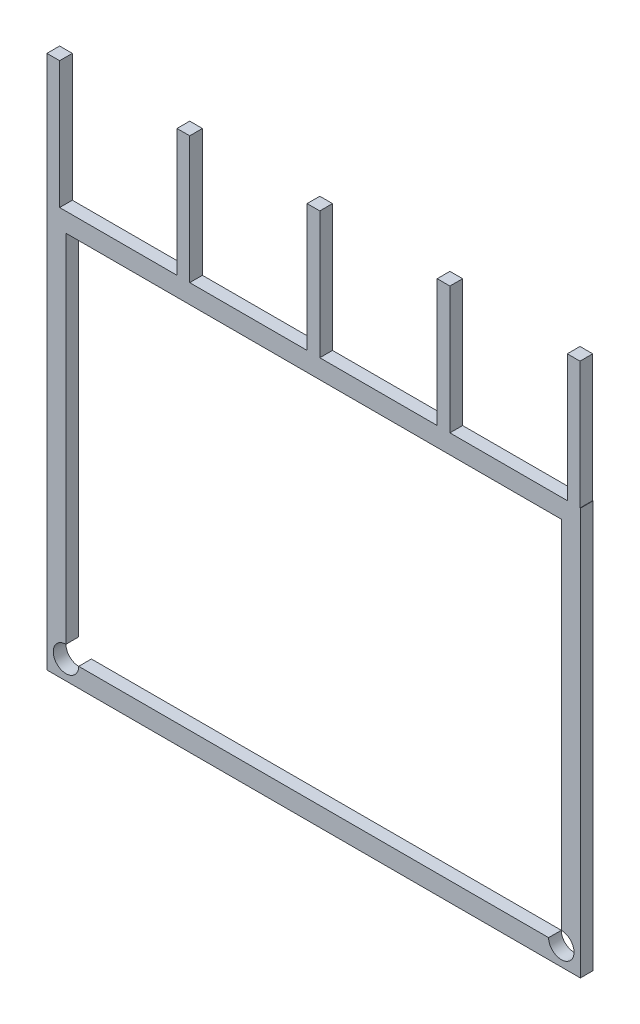
ISO-10303-21;
HEADER;
FILE_DESCRIPTION(('STEP AP214'),'2;1');
FILE_NAME('part.step','',(''),(''),'','','');
FILE_SCHEMA(('AUTOMOTIVE_DESIGN { 1 0 10303 214 1 1 1 1 }'));
ENDSEC;
DATA;
#1=APPLICATION_CONTEXT('core data for automotive mechanical design processes');
#2=APPLICATION_PROTOCOL_DEFINITION('international standard','automotive_design',2000,#1);
#3=PRODUCT_CONTEXT('',#1,'mechanical');
#4=PRODUCT('Part','Part','',(#3));
#5=PRODUCT_RELATED_PRODUCT_CATEGORY('part','',(#4));
#6=PRODUCT_DEFINITION_FORMATION('','',#4);
#7=PRODUCT_DEFINITION_CONTEXT('part definition',#1,'design');
#8=PRODUCT_DEFINITION('design','',#6,#7);
#9=PRODUCT_DEFINITION_SHAPE('','',#8);
#10=(LENGTH_UNIT() NAMED_UNIT(*) SI_UNIT(.MILLI.,.METRE.));
#11=(NAMED_UNIT(*) PLANE_ANGLE_UNIT() SI_UNIT($,.RADIAN.));
#12=(NAMED_UNIT(*) SI_UNIT($,.STERADIAN.) SOLID_ANGLE_UNIT());
#13=UNCERTAINTY_MEASURE_WITH_UNIT(LENGTH_MEASURE(1.E-05),#10,'distance_accuracy_value','');
#14=(GEOMETRIC_REPRESENTATION_CONTEXT(3) GLOBAL_UNCERTAINTY_ASSIGNED_CONTEXT((#13)) GLOBAL_UNIT_ASSIGNED_CONTEXT((#10,
#11,#12)) REPRESENTATION_CONTEXT('',''));
#15=CARTESIAN_POINT('',(0.,0.,0.));
#16=DIRECTION('',(0.,0.,1.));
#17=DIRECTION('',(1.,0.,0.));
#18=AXIS2_PLACEMENT_3D('',#15,#16,#17);
#19=CARTESIAN_POINT('',(0.,15.9965,0.5));
#20=DIRECTION('',(0.,-1.,0.));
#21=DIRECTION('',(0.,0.,-1.));
#22=AXIS2_PLACEMENT_3D('',#19,#20,#21);
#23=PLANE('',#22);
#24=DIRECTION('',(0.,0.,1.));
#25=VECTOR('',#24,1.);
#26=CARTESIAN_POINT('',(19.945,15.9965,-0.5));
#27=LINE('',#26,#25);
#28=CARTESIAN_POINT('',(19.945,15.9965,-0.5));
#29=VERTEX_POINT('',#28);
#30=CARTESIAN_POINT('',(19.945,15.9965,0.5));
#31=VERTEX_POINT('',#30);
#32=EDGE_CURVE('E244',#29,#31,#27,.T.);
#33=ORIENTED_EDGE('',*,*,#32,.F.);
#34=DIRECTION('',(-1.,0.,0.));
#35=VECTOR('',#34,1.);
#36=CARTESIAN_POINT('',(0.,15.9965,-0.5));
#37=LINE('',#36,#35);
#38=CARTESIAN_POINT('',(10.715,15.9965,-0.5));
#39=VERTEX_POINT('',#38);
#40=EDGE_CURVE('E406',#29,#39,#37,.T.);
#41=ORIENTED_EDGE('',*,*,#40,.T.);
#42=DIRECTION('',(0.,0.,-1.));
#43=VECTOR('',#42,1.);
#44=CARTESIAN_POINT('',(10.715,15.9965,-0.5));
#45=LINE('',#44,#43);
#46=CARTESIAN_POINT('',(10.715,15.9965,0.5));
#47=VERTEX_POINT('',#46);
#48=EDGE_CURVE('E248',#47,#39,#45,.T.);
#49=ORIENTED_EDGE('',*,*,#48,.F.);
#50=DIRECTION('',(-1.,0.,0.));
#51=VECTOR('',#50,1.);
#52=CARTESIAN_POINT('',(0.,15.9965,0.5));
#53=LINE('',#52,#51);
#54=EDGE_CURVE('E52',#31,#47,#53,.T.);
#55=ORIENTED_EDGE('',*,*,#54,.F.);
#56=EDGE_LOOP('',(#33,#41,#49,#55));
#57=FACE_BOUND('',#56,.T.);
#58=ADVANCED_FACE('F35',(#57),#23,.F.);
#59=DIRECTION('',(0.,0.,-1.));
#60=VECTOR('',#59,1.);
#61=CARTESIAN_POINT('',(20.945,15.9965,-0.5));
#62=LINE('',#61,#60);
#63=CARTESIAN_POINT('',(20.945,15.9965,0.5));
#64=VERTEX_POINT('',#63);
#65=CARTESIAN_POINT('',(20.945,15.9965,-0.5));
#66=VERTEX_POINT('',#65);
#67=EDGE_CURVE('E60',#64,#66,#62,.T.);
#68=ORIENTED_EDGE('',*,*,#67,.F.);
#69=CARTESIAN_POINT('',(20.975,15.9965,0.5));
#70=VERTEX_POINT('',#69);
#71=EDGE_CURVE('E375',#70,#64,#53,.T.);
#72=ORIENTED_EDGE('',*,*,#71,.F.);
#73=DIRECTION('',(0.,0.,-1.));
#74=VECTOR('',#73,1.);
#75=CARTESIAN_POINT('',(20.975,15.9965,0.5));
#76=LINE('',#75,#74);
#77=CARTESIAN_POINT('',(20.975,15.9965,-0.5));
#78=VERTEX_POINT('',#77);
#79=EDGE_CURVE('E44',#70,#78,#76,.T.);
#80=ORIENTED_EDGE('',*,*,#79,.T.);
#81=EDGE_CURVE('E404',#78,#66,#37,.T.);
#82=ORIENTED_EDGE('',*,*,#81,.T.);
#83=EDGE_LOOP('',(#68,#72,#80,#82));
#84=FACE_BOUND('',#83,.T.);
#85=ADVANCED_FACE('F461',(#84),#23,.F.);
#86=DIRECTION('',(0.,0.,1.));
#87=VECTOR('',#86,1.);
#88=CARTESIAN_POINT('',(9.715,15.9965,-0.5));
#89=LINE('',#88,#87);
#90=CARTESIAN_POINT('',(9.715,15.9965,-0.5));
#91=VERTEX_POINT('',#90);
#92=CARTESIAN_POINT('',(9.715,15.9965,0.5));
#93=VERTEX_POINT('',#92);
#94=EDGE_CURVE('E245',#91,#93,#89,.T.);
#95=ORIENTED_EDGE('',*,*,#94,.F.);
#96=CARTESIAN_POINT('',(0.484999999999999,15.9965,-0.5));
#97=VERTEX_POINT('',#96);
#98=EDGE_CURVE('E492',#91,#97,#37,.T.);
#99=ORIENTED_EDGE('',*,*,#98,.T.);
#100=DIRECTION('',(0.,0.,-1.));
#101=VECTOR('',#100,1.);
#102=CARTESIAN_POINT('',(0.484999999999999,15.9965,-0.5));
#103=LINE('',#102,#101);
#104=CARTESIAN_POINT('',(0.484999999999999,15.9965,0.5));
#105=VERTEX_POINT('',#104);
#106=EDGE_CURVE('E282',#105,#97,#103,.T.);
#107=ORIENTED_EDGE('',*,*,#106,.F.);
#108=EDGE_CURVE('E509',#93,#105,#53,.T.);
#109=ORIENTED_EDGE('',*,*,#108,.F.);
#110=EDGE_LOOP('',(#95,#99,#107,#109));
#111=FACE_BOUND('',#110,.T.);
#112=ADVANCED_FACE('F467',(#111),#23,.F.);
#113=DIRECTION('',(0.,0.,1.));
#114=VECTOR('',#113,1.);
#115=CARTESIAN_POINT('',(-0.515000000000002,15.9965,-0.5));
#116=LINE('',#115,#114);
#117=CARTESIAN_POINT('',(-0.515000000000002,15.9965,-0.5));
#118=VERTEX_POINT('',#117);
#119=CARTESIAN_POINT('',(-0.515000000000002,15.9965,0.5));
#120=VERTEX_POINT('',#119);
#121=EDGE_CURVE('E277',#118,#120,#116,.T.);
#122=ORIENTED_EDGE('',*,*,#121,.F.);
#123=CARTESIAN_POINT('',(-9.745,15.9965,-0.5));
#124=VERTEX_POINT('',#123);
#125=EDGE_CURVE('E491',#118,#124,#37,.T.);
#126=ORIENTED_EDGE('',*,*,#125,.T.);
#127=DIRECTION('',(0.,0.,-1.));
#128=VECTOR('',#127,1.);
#129=CARTESIAN_POINT('',(-9.745,15.9965,-0.5));
#130=LINE('',#129,#128);
#131=CARTESIAN_POINT('',(-9.745,15.9965,0.5));
#132=VERTEX_POINT('',#131);
#133=EDGE_CURVE('E309',#132,#124,#130,.T.);
#134=ORIENTED_EDGE('',*,*,#133,.F.);
#135=EDGE_CURVE('E510',#120,#132,#53,.T.);
#136=ORIENTED_EDGE('',*,*,#135,.F.);
#137=EDGE_LOOP('',(#122,#126,#134,#136));
#138=FACE_BOUND('',#137,.T.);
#139=ADVANCED_FACE('F471',(#138),#23,.F.);
#140=DIRECTION('',(0.,0.,1.));
#141=VECTOR('',#140,1.);
#142=CARTESIAN_POINT('',(-10.745,15.9965,-0.5));
#143=LINE('',#142,#141);
#144=CARTESIAN_POINT('',(-10.745,15.9965,-0.5));
#145=VERTEX_POINT('',#144);
#146=CARTESIAN_POINT('',(-10.745,15.9965,0.5));
#147=VERTEX_POINT('',#146);
#148=EDGE_CURVE('E304',#145,#147,#143,.T.);
#149=ORIENTED_EDGE('',*,*,#148,.F.);
#150=CARTESIAN_POINT('',(-19.975,15.9965,-0.5));
#151=VERTEX_POINT('',#150);
#152=EDGE_CURVE('E403',#145,#151,#37,.T.);
#153=ORIENTED_EDGE('',*,*,#152,.T.);
#154=DIRECTION('',(0.,0.,-1.));
#155=VECTOR('',#154,1.);
#156=CARTESIAN_POINT('',(-19.975,15.9965,-0.5));
#157=LINE('',#156,#155);
#158=CARTESIAN_POINT('',(-19.975,15.9965,0.5));
#159=VERTEX_POINT('',#158);
#160=EDGE_CURVE('E331',#159,#151,#157,.T.);
#161=ORIENTED_EDGE('',*,*,#160,.F.);
#162=EDGE_CURVE('E374',#147,#159,#53,.T.);
#163=ORIENTED_EDGE('',*,*,#162,.F.);
#164=EDGE_LOOP('',(#149,#153,#161,#163));
#165=FACE_BOUND('',#164,.T.);
#166=ADVANCED_FACE('F463',(#165),#23,.F.);
#167=CARTESIAN_POINT('',(0.,-15.9965,0.5));
#168=DIRECTION('',(0.,-1.,0.));
#169=DIRECTION('',(0.,0.,-1.));
#170=AXIS2_PLACEMENT_3D('',#167,#168,#169);
#171=PLANE('',#170);
#172=DIRECTION('',(-1.,0.,0.));
#173=VECTOR('',#172,1.);
#174=CARTESIAN_POINT('',(0.,-15.9965,-0.5));
#175=LINE('',#174,#173);
#176=CARTESIAN_POINT('',(20.975,-15.9965,-0.5));
#177=VERTEX_POINT('',#176);
#178=CARTESIAN_POINT('',(-20.975,-15.9965,-0.5));
#179=VERTEX_POINT('',#178);
#180=EDGE_CURVE('E397',#177,#179,#175,.T.);
#181=ORIENTED_EDGE('',*,*,#180,.F.);
#182=DIRECTION('',(0.,0.,-1.));
#183=VECTOR('',#182,1.);
#184=CARTESIAN_POINT('',(20.975,-15.9965,0.5));
#185=LINE('',#184,#183);
#186=CARTESIAN_POINT('',(20.975,-15.9965,0.5));
#187=VERTEX_POINT('',#186);
#188=EDGE_CURVE('E11',#187,#177,#185,.T.);
#189=ORIENTED_EDGE('',*,*,#188,.F.);
#190=DIRECTION('',(-1.,0.,0.));
#191=VECTOR('',#190,1.);
#192=CARTESIAN_POINT('',(0.,-15.9965,0.5));
#193=LINE('',#192,#191);
#194=CARTESIAN_POINT('',(-20.975,-15.9965,0.5));
#195=VERTEX_POINT('',#194);
#196=EDGE_CURVE('E368',#187,#195,#193,.T.);
#197=ORIENTED_EDGE('',*,*,#196,.T.);
#198=DIRECTION('',(0.,0.,-1.));
#199=VECTOR('',#198,1.);
#200=CARTESIAN_POINT('',(-20.975,-15.9965,0.5));
#201=LINE('',#200,#199);
#202=EDGE_CURVE('E408',#195,#179,#201,.T.);
#203=ORIENTED_EDGE('',*,*,#202,.T.);
#204=EDGE_LOOP('',(#181,#189,#197,#203));
#205=FACE_BOUND('',#204,.T.);
#206=ADVANCED_FACE('F470',(#205),#171,.T.);
#207=CARTESIAN_POINT('',(20.975,0.,0.5));
#208=DIRECTION('',(-1.,0.,0.));
#209=DIRECTION('',(0.,0.,1.));
#210=AXIS2_PLACEMENT_3D('',#207,#208,#209);
#211=PLANE('',#210);
#212=DIRECTION('',(0.,1.,0.));
#213=VECTOR('',#212,1.);
#214=CARTESIAN_POINT('',(20.975,0.,-0.5));
#215=LINE('',#214,#213);
#216=EDGE_CURVE('E400',#177,#78,#215,.T.);
#217=ORIENTED_EDGE('',*,*,#216,.T.);
#218=ORIENTED_EDGE('',*,*,#79,.F.);
#219=DIRECTION('',(0.,1.,0.));
#220=VECTOR('',#219,1.);
#221=CARTESIAN_POINT('',(20.975,0.,0.5));
#222=LINE('',#221,#220);
#223=EDGE_CURVE('E371',#187,#70,#222,.T.);
#224=ORIENTED_EDGE('',*,*,#223,.F.);
#225=ORIENTED_EDGE('',*,*,#188,.T.);
#226=EDGE_LOOP('',(#217,#218,#224,#225));
#227=FACE_BOUND('',#226,.T.);
#228=ADVANCED_FACE('F477',(#227),#211,.F.);
#229=CARTESIAN_POINT('',(19.475,-14.4965,0.5));
#230=DIRECTION('',(0.,0.,-1.));
#231=DIRECTION('',(-1.,0.,0.));
#232=AXIS2_PLACEMENT_3D('',#229,#230,#231);
#233=CYLINDRICAL_SURFACE('',#232,1.);
#234=CARTESIAN_POINT('',(19.475,-14.4965,-0.5));
#235=DIRECTION('',(0.,0.,1.));
#236=DIRECTION('',(1.,0.,0.));
#237=AXIS2_PLACEMENT_3D('',#234,#235,#236);
#238=CIRCLE('',#237,1.);
#239=CARTESIAN_POINT('',(18.475,-14.4965,-0.5));
#240=VERTEX_POINT('',#239);
#241=CARTESIAN_POINT('',(19.475,-13.4965,-0.5));
#242=VERTEX_POINT('',#241);
#243=EDGE_CURVE('E350',#240,#242,#238,.T.);
#244=ORIENTED_EDGE('',*,*,#243,.F.);
#245=DIRECTION('',(0.,0.,-1.));
#246=VECTOR('',#245,1.);
#247=CARTESIAN_POINT('',(18.475,-14.4965,0.5));
#248=LINE('',#247,#246);
#249=CARTESIAN_POINT('',(18.475,-14.4965,0.5));
#250=VERTEX_POINT('',#249);
#251=EDGE_CURVE('E39',#250,#240,#248,.T.);
#252=ORIENTED_EDGE('',*,*,#251,.F.);
#253=CARTESIAN_POINT('',(19.475,-14.4965,0.5));
#254=DIRECTION('',(0.,0.,1.));
#255=DIRECTION('',(1.,0.,0.));
#256=AXIS2_PLACEMENT_3D('',#253,#254,#255);
#257=CIRCLE('',#256,1.);
#258=CARTESIAN_POINT('',(19.475,-13.4965,0.5));
#259=VERTEX_POINT('',#258);
#260=EDGE_CURVE('E351',#250,#259,#257,.T.);
#261=ORIENTED_EDGE('',*,*,#260,.T.);
#262=DIRECTION('',(0.,0.,-1.));
#263=VECTOR('',#262,1.);
#264=CARTESIAN_POINT('',(19.475,-13.4965,0.5));
#265=LINE('',#264,#263);
#266=EDGE_CURVE('E379',#259,#242,#265,.T.);
#267=ORIENTED_EDGE('',*,*,#266,.T.);
#268=EDGE_LOOP('',(#244,#252,#261,#267));
#269=FACE_BOUND('',#268,.T.);
#270=ADVANCED_FACE('F37',(#269),#233,.F.);
#271=CARTESIAN_POINT('',(0.,-14.4965,0.5));
#272=DIRECTION('',(0.,-1.,0.));
#273=DIRECTION('',(0.,0.,-1.));
#274=AXIS2_PLACEMENT_3D('',#271,#272,#273);
#275=PLANE('',#274);
#276=DIRECTION('',(-1.,0.,0.));
#277=VECTOR('',#276,1.);
#278=CARTESIAN_POINT('',(0.,-14.4965,-0.5));
#279=LINE('',#278,#277);
#280=CARTESIAN_POINT('',(-18.475,-14.4965,-0.5));
#281=VERTEX_POINT('',#280);
#282=EDGE_CURVE('E382',#240,#281,#279,.T.);
#283=ORIENTED_EDGE('',*,*,#282,.T.);
#284=DIRECTION('',(0.,0.,-1.));
#285=VECTOR('',#284,1.);
#286=CARTESIAN_POINT('',(-18.475,-14.4965,0.5));
#287=LINE('',#286,#285);
#288=CARTESIAN_POINT('',(-18.475,-14.4965,0.5));
#289=VERTEX_POINT('',#288);
#290=EDGE_CURVE('E418',#289,#281,#287,.T.);
#291=ORIENTED_EDGE('',*,*,#290,.F.);
#292=DIRECTION('',(-1.,0.,0.));
#293=VECTOR('',#292,1.);
#294=CARTESIAN_POINT('',(0.,-14.4965,0.5));
#295=LINE('',#294,#293);
#296=EDGE_CURVE('E354',#250,#289,#295,.T.);
#297=ORIENTED_EDGE('',*,*,#296,.F.);
#298=ORIENTED_EDGE('',*,*,#251,.T.);
#299=EDGE_LOOP('',(#283,#291,#297,#298));
#300=FACE_BOUND('',#299,.T.);
#301=ADVANCED_FACE('F425',(#300),#275,.F.);
#302=CARTESIAN_POINT('',(-19.475,-14.4965,0.5));
#303=DIRECTION('',(0.,0.,-1.));
#304=DIRECTION('',(-1.,0.,0.));
#305=AXIS2_PLACEMENT_3D('',#302,#303,#304);
#306=CYLINDRICAL_SURFACE('',#305,1.);
#307=CARTESIAN_POINT('',(-19.475,-14.4965,-0.5));
#308=DIRECTION('',(0.,0.,1.));
#309=DIRECTION('',(1.,0.,0.));
#310=AXIS2_PLACEMENT_3D('',#307,#308,#309);
#311=CIRCLE('',#310,1.);
#312=CARTESIAN_POINT('',(-19.475,-13.4965,-0.5));
#313=VERTEX_POINT('',#312);
#314=EDGE_CURVE('E385',#313,#281,#311,.T.);
#315=ORIENTED_EDGE('',*,*,#314,.F.);
#316=DIRECTION('',(0.,0.,-1.));
#317=VECTOR('',#316,1.);
#318=CARTESIAN_POINT('',(-19.475,-13.4965,0.5));
#319=LINE('',#318,#317);
#320=CARTESIAN_POINT('',(-19.475,-13.4965,0.5));
#321=VERTEX_POINT('',#320);
#322=EDGE_CURVE('E417',#321,#313,#319,.T.);
#323=ORIENTED_EDGE('',*,*,#322,.F.);
#324=CARTESIAN_POINT('',(-19.475,-14.4965,0.5));
#325=DIRECTION('',(0.,0.,1.));
#326=DIRECTION('',(1.,0.,0.));
#327=AXIS2_PLACEMENT_3D('',#324,#325,#326);
#328=CIRCLE('',#327,1.);
#329=EDGE_CURVE('E357',#321,#289,#328,.T.);
#330=ORIENTED_EDGE('',*,*,#329,.T.);
#331=ORIENTED_EDGE('',*,*,#290,.T.);
#332=EDGE_LOOP('',(#315,#323,#330,#331));
#333=FACE_BOUND('',#332,.T.);
#334=ADVANCED_FACE('F446',(#333),#306,.F.);
#335=CARTESIAN_POINT('',(-19.475,0.,0.5));
#336=DIRECTION('',(-1.,0.,0.));
#337=DIRECTION('',(0.,0.,1.));
#338=AXIS2_PLACEMENT_3D('',#335,#336,#337);
#339=PLANE('',#338);
#340=DIRECTION('',(0.,1.,0.));
#341=VECTOR('',#340,1.);
#342=CARTESIAN_POINT('',(-19.475,0.,-0.5));
#343=LINE('',#342,#341);
#344=CARTESIAN_POINT('',(-19.475,14.4965,-0.5));
#345=VERTEX_POINT('',#344);
#346=EDGE_CURVE('E388',#313,#345,#343,.T.);
#347=ORIENTED_EDGE('',*,*,#346,.T.);
#348=DIRECTION('',(0.,0.,-1.));
#349=VECTOR('',#348,1.);
#350=CARTESIAN_POINT('',(-19.475,14.4965,0.5));
#351=LINE('',#350,#349);
#352=CARTESIAN_POINT('',(-19.475,14.4965,0.5));
#353=VERTEX_POINT('',#352);
#354=EDGE_CURVE('E415',#353,#345,#351,.T.);
#355=ORIENTED_EDGE('',*,*,#354,.F.);
#356=DIRECTION('',(0.,1.,0.));
#357=VECTOR('',#356,1.);
#358=CARTESIAN_POINT('',(-19.475,0.,0.5));
#359=LINE('',#358,#357);
#360=EDGE_CURVE('E360',#321,#353,#359,.T.);
#361=ORIENTED_EDGE('',*,*,#360,.F.);
#362=ORIENTED_EDGE('',*,*,#322,.T.);
#363=EDGE_LOOP('',(#347,#355,#361,#362));
#364=FACE_BOUND('',#363,.T.);
#365=ADVANCED_FACE('F444',(#364),#339,.F.);
#366=CARTESIAN_POINT('',(0.,14.4965,0.5));
#367=DIRECTION('',(0.,-1.,0.));
#368=DIRECTION('',(0.,0.,-1.));
#369=AXIS2_PLACEMENT_3D('',#366,#367,#368);
#370=PLANE('',#369);
#371=DIRECTION('',(-1.,0.,0.));
#372=VECTOR('',#371,1.);
#373=CARTESIAN_POINT('',(0.,14.4965,-0.5));
#374=LINE('',#373,#372);
#375=CARTESIAN_POINT('',(19.475,14.4965,-0.5));
#376=VERTEX_POINT('',#375);
#377=EDGE_CURVE('E391',#376,#345,#374,.T.);
#378=ORIENTED_EDGE('',*,*,#377,.F.);
#379=DIRECTION('',(0.,0.,-1.));
#380=VECTOR('',#379,1.);
#381=CARTESIAN_POINT('',(19.475,14.4965,0.5));
#382=LINE('',#381,#380);
#383=CARTESIAN_POINT('',(19.475,14.4965,0.5));
#384=VERTEX_POINT('',#383);
#385=EDGE_CURVE('E413',#384,#376,#382,.T.);
#386=ORIENTED_EDGE('',*,*,#385,.F.);
#387=DIRECTION('',(-1.,0.,0.));
#388=VECTOR('',#387,1.);
#389=CARTESIAN_POINT('',(0.,14.4965,0.5));
#390=LINE('',#389,#388);
#391=EDGE_CURVE('E362',#384,#353,#390,.T.);
#392=ORIENTED_EDGE('',*,*,#391,.T.);
#393=ORIENTED_EDGE('',*,*,#354,.T.);
#394=EDGE_LOOP('',(#378,#386,#392,#393));
#395=FACE_BOUND('',#394,.T.);
#396=ADVANCED_FACE('F439',(#395),#370,.T.);
#397=CARTESIAN_POINT('',(19.475,0.,0.5));
#398=DIRECTION('',(-1.,0.,0.));
#399=DIRECTION('',(0.,0.,1.));
#400=AXIS2_PLACEMENT_3D('',#397,#398,#399);
#401=PLANE('',#400);
#402=DIRECTION('',(0.,1.,0.));
#403=VECTOR('',#402,1.);
#404=CARTESIAN_POINT('',(19.475,0.,-0.5));
#405=LINE('',#404,#403);
#406=EDGE_CURVE('E394',#242,#376,#405,.T.);
#407=ORIENTED_EDGE('',*,*,#406,.F.);
#408=ORIENTED_EDGE('',*,*,#266,.F.);
#409=DIRECTION('',(0.,1.,0.));
#410=VECTOR('',#409,1.);
#411=CARTESIAN_POINT('',(19.475,0.,0.5));
#412=LINE('',#411,#410);
#413=EDGE_CURVE('E365',#259,#384,#412,.T.);
#414=ORIENTED_EDGE('',*,*,#413,.T.);
#415=ORIENTED_EDGE('',*,*,#385,.T.);
#416=EDGE_LOOP('',(#407,#408,#414,#415));
#417=FACE_BOUND('',#416,.T.);
#418=ADVANCED_FACE('F436',(#417),#401,.T.);
#419=CARTESIAN_POINT('',(-20.975,0.,0.5));
#420=DIRECTION('',(-1.,0.,0.));
#421=DIRECTION('',(0.,0.,1.));
#422=AXIS2_PLACEMENT_3D('',#419,#420,#421);
#423=PLANE('',#422);
#424=DIRECTION('',(0.,1.,0.));
#425=VECTOR('',#424,1.);
#426=CARTESIAN_POINT('',(-20.975,0.,-0.5));
#427=LINE('',#426,#425);
#428=CARTESIAN_POINT('',(-20.975,25.9965,-0.5));
#429=VERTEX_POINT('',#428);
#430=EDGE_CURVE('E355',#179,#429,#427,.T.);
#431=ORIENTED_EDGE('',*,*,#430,.F.);
#432=ORIENTED_EDGE('',*,*,#202,.F.);
#433=DIRECTION('',(0.,1.,0.));
#434=VECTOR('',#433,1.);
#435=CARTESIAN_POINT('',(-20.975,0.,0.5));
#436=LINE('',#435,#434);
#437=CARTESIAN_POINT('',(-20.975,25.9965,0.5));
#438=VERTEX_POINT('',#437);
#439=EDGE_CURVE('E377',#195,#438,#436,.T.);
#440=ORIENTED_EDGE('',*,*,#439,.T.);
#441=DIRECTION('',(0.,0.,1.));
#442=VECTOR('',#441,1.);
#443=CARTESIAN_POINT('',(-20.975,25.9965,-0.5));
#444=LINE('',#443,#442);
#445=EDGE_CURVE('E332',#429,#438,#444,.T.);
#446=ORIENTED_EDGE('',*,*,#445,.F.);
#447=EDGE_LOOP('',(#431,#432,#440,#446));
#448=FACE_BOUND('',#447,.T.);
#449=ADVANCED_FACE('F449',(#448),#423,.T.);
#450=CARTESIAN_POINT('',(0.,0.,0.5));
#451=DIRECTION('',(0.,0.,1.));
#452=DIRECTION('',(1.,0.,0.));
#453=AXIS2_PLACEMENT_3D('',#450,#451,#452);
#454=PLANE('',#453);
#455=ORIENTED_EDGE('',*,*,#260,.F.);
#456=ORIENTED_EDGE('',*,*,#296,.T.);
#457=ORIENTED_EDGE('',*,*,#329,.F.);
#458=ORIENTED_EDGE('',*,*,#360,.T.);
#459=ORIENTED_EDGE('',*,*,#391,.F.);
#460=ORIENTED_EDGE('',*,*,#413,.F.);
#461=EDGE_LOOP('',(#455,#456,#457,#458,#459,#460));
#462=FACE_BOUND('',#461,.T.);
#463=ORIENTED_EDGE('',*,*,#196,.F.);
#464=ORIENTED_EDGE('',*,*,#223,.T.);
#465=ORIENTED_EDGE('',*,*,#71,.T.);
#466=DIRECTION('',(0.,-1.,0.));
#467=VECTOR('',#466,1.);
#468=CARTESIAN_POINT('',(20.945,25.9965,0.5));
#469=LINE('',#468,#467);
#470=CARTESIAN_POINT('',(20.945,25.9965,0.5));
#471=VERTEX_POINT('',#470);
#472=EDGE_CURVE('E229',#471,#64,#469,.T.);
#473=ORIENTED_EDGE('',*,*,#472,.F.);
#474=DIRECTION('',(1.,0.,0.));
#475=VECTOR('',#474,1.);
#476=CARTESIAN_POINT('',(20.945,25.9965,0.5));
#477=LINE('',#476,#475);
#478=CARTESIAN_POINT('',(19.945,25.9965,0.5));
#479=VERTEX_POINT('',#478);
#480=EDGE_CURVE('E221',#479,#471,#477,.T.);
#481=ORIENTED_EDGE('',*,*,#480,.F.);
#482=DIRECTION('',(0.,-1.,0.));
#483=VECTOR('',#482,1.);
#484=CARTESIAN_POINT('',(19.945,25.9965,0.5));
#485=LINE('',#484,#483);
#486=EDGE_CURVE('E226',#479,#31,#485,.T.);
#487=ORIENTED_EDGE('',*,*,#486,.T.);
#488=ORIENTED_EDGE('',*,*,#54,.T.);
#489=DIRECTION('',(0.,-1.,0.));
#490=VECTOR('',#489,1.);
#491=CARTESIAN_POINT('',(10.715,25.9965,0.5));
#492=LINE('',#491,#490);
#493=CARTESIAN_POINT('',(10.715,25.9965,0.5));
#494=VERTEX_POINT('',#493);
#495=EDGE_CURVE('E271',#494,#47,#492,.T.);
#496=ORIENTED_EDGE('',*,*,#495,.F.);
#497=DIRECTION('',(1.,0.,0.));
#498=VECTOR('',#497,1.);
#499=CARTESIAN_POINT('',(10.715,25.9965,0.5));
#500=LINE('',#499,#498);
#501=CARTESIAN_POINT('',(9.715,25.9965,0.5));
#502=VERTEX_POINT('',#501);
#503=EDGE_CURVE('E257',#502,#494,#500,.T.);
#504=ORIENTED_EDGE('',*,*,#503,.F.);
#505=DIRECTION('',(0.,-1.,0.));
#506=VECTOR('',#505,1.);
#507=CARTESIAN_POINT('',(9.715,25.9965,0.5));
#508=LINE('',#507,#506);
#509=EDGE_CURVE('E274',#502,#93,#508,.T.);
#510=ORIENTED_EDGE('',*,*,#509,.T.);
#511=ORIENTED_EDGE('',*,*,#108,.T.);
#512=DIRECTION('',(0.,-1.,0.));
#513=VECTOR('',#512,1.);
#514=CARTESIAN_POINT('',(0.484999999999999,25.9965,0.5));
#515=LINE('',#514,#513);
#516=CARTESIAN_POINT('',(0.484999999999999,25.9965,0.5));
#517=VERTEX_POINT('',#516);
#518=EDGE_CURVE('E298',#517,#105,#515,.T.);
#519=ORIENTED_EDGE('',*,*,#518,.F.);
#520=DIRECTION('',(1.,0.,0.));
#521=VECTOR('',#520,1.);
#522=CARTESIAN_POINT('',(0.484999999999999,25.9965,0.5));
#523=LINE('',#522,#521);
#524=CARTESIAN_POINT('',(-0.515000000000002,25.9965,0.5));
#525=VERTEX_POINT('',#524);
#526=EDGE_CURVE('E281',#525,#517,#523,.T.);
#527=ORIENTED_EDGE('',*,*,#526,.F.);
#528=DIRECTION('',(0.,-1.,0.));
#529=VECTOR('',#528,1.);
#530=CARTESIAN_POINT('',(-0.515000000000002,25.9965,0.5));
#531=LINE('',#530,#529);
#532=EDGE_CURVE('E301',#525,#120,#531,.T.);
#533=ORIENTED_EDGE('',*,*,#532,.T.);
#534=ORIENTED_EDGE('',*,*,#135,.T.);
#535=DIRECTION('',(0.,-1.,0.));
#536=VECTOR('',#535,1.);
#537=CARTESIAN_POINT('',(-9.745,25.9965,0.5));
#538=LINE('',#537,#536);
#539=CARTESIAN_POINT('',(-9.745,25.9965,0.5));
#540=VERTEX_POINT('',#539);
#541=EDGE_CURVE('E325',#540,#132,#538,.T.);
#542=ORIENTED_EDGE('',*,*,#541,.F.);
#543=DIRECTION('',(1.,0.,0.));
#544=VECTOR('',#543,1.);
#545=CARTESIAN_POINT('',(-9.745,25.9965,0.5));
#546=LINE('',#545,#544);
#547=CARTESIAN_POINT('',(-10.745,25.9965,0.5));
#548=VERTEX_POINT('',#547);
#549=EDGE_CURVE('E308',#548,#540,#546,.T.);
#550=ORIENTED_EDGE('',*,*,#549,.F.);
#551=DIRECTION('',(0.,-1.,0.));
#552=VECTOR('',#551,1.);
#553=CARTESIAN_POINT('',(-10.745,25.9965,0.5));
#554=LINE('',#553,#552);
#555=EDGE_CURVE('E328',#548,#147,#554,.T.);
#556=ORIENTED_EDGE('',*,*,#555,.T.);
#557=ORIENTED_EDGE('',*,*,#162,.T.);
#558=DIRECTION('',(0.,-1.,0.));
#559=VECTOR('',#558,1.);
#560=CARTESIAN_POINT('',(-19.975,25.9965,0.5));
#561=LINE('',#560,#559);
#562=CARTESIAN_POINT('',(-19.975,25.9965,0.5));
#563=VERTEX_POINT('',#562);
#564=EDGE_CURVE('E347',#563,#159,#561,.T.);
#565=ORIENTED_EDGE('',*,*,#564,.F.);
#566=DIRECTION('',(1.,0.,0.));
#567=VECTOR('',#566,1.);
#568=CARTESIAN_POINT('',(-19.975,25.9965,0.5));
#569=LINE('',#568,#567);
#570=EDGE_CURVE('E335',#438,#563,#569,.T.);
#571=ORIENTED_EDGE('',*,*,#570,.F.);
#572=ORIENTED_EDGE('',*,*,#439,.F.);
#573=EDGE_LOOP('',(#463,#464,#465,#473,#481,#487,#488,#496,#504,#510,#511,#519,#527,#533,#534,
#542,#550,#556,#557,#565,#571,#572));
#574=FACE_BOUND('',#573,.T.);
#575=ADVANCED_FACE('F224',(#462,#574),#454,.T.);
#576=CARTESIAN_POINT('',(0.,0.,-0.5));
#577=DIRECTION('',(0.,0.,1.));
#578=DIRECTION('',(1.,0.,0.));
#579=AXIS2_PLACEMENT_3D('',#576,#577,#578);
#580=PLANE('',#579);
#581=ORIENTED_EDGE('',*,*,#243,.T.);
#582=ORIENTED_EDGE('',*,*,#406,.T.);
#583=ORIENTED_EDGE('',*,*,#377,.T.);
#584=ORIENTED_EDGE('',*,*,#346,.F.);
#585=ORIENTED_EDGE('',*,*,#314,.T.);
#586=ORIENTED_EDGE('',*,*,#282,.F.);
#587=EDGE_LOOP('',(#581,#582,#583,#584,#585,#586));
#588=FACE_BOUND('',#587,.T.);
#589=ORIENTED_EDGE('',*,*,#180,.T.);
#590=ORIENTED_EDGE('',*,*,#430,.T.);
#591=DIRECTION('',(-1.,0.,0.));
#592=VECTOR('',#591,1.);
#593=CARTESIAN_POINT('',(-19.975,25.9965,-0.5));
#594=LINE('',#593,#592);
#595=CARTESIAN_POINT('',(-19.975,25.9965,-0.5));
#596=VERTEX_POINT('',#595);
#597=EDGE_CURVE('E339',#596,#429,#594,.T.);
#598=ORIENTED_EDGE('',*,*,#597,.F.);
#599=DIRECTION('',(0.,-1.,0.));
#600=VECTOR('',#599,1.);
#601=CARTESIAN_POINT('',(-19.975,25.9965,-0.5));
#602=LINE('',#601,#600);
#603=EDGE_CURVE('E342',#596,#151,#602,.T.);
#604=ORIENTED_EDGE('',*,*,#603,.T.);
#605=ORIENTED_EDGE('',*,*,#152,.F.);
#606=DIRECTION('',(0.,-1.,0.));
#607=VECTOR('',#606,1.);
#608=CARTESIAN_POINT('',(-10.745,25.9965,-0.5));
#609=LINE('',#608,#607);
#610=CARTESIAN_POINT('',(-10.745,25.9965,-0.5));
#611=VERTEX_POINT('',#610);
#612=EDGE_CURVE('E315',#611,#145,#609,.T.);
#613=ORIENTED_EDGE('',*,*,#612,.F.);
#614=DIRECTION('',(-1.,0.,0.));
#615=VECTOR('',#614,1.);
#616=CARTESIAN_POINT('',(-9.745,25.9965,-0.5));
#617=LINE('',#616,#615);
#618=CARTESIAN_POINT('',(-9.745,25.9965,-0.5));
#619=VERTEX_POINT('',#618);
#620=EDGE_CURVE('E313',#619,#611,#617,.T.);
#621=ORIENTED_EDGE('',*,*,#620,.F.);
#622=DIRECTION('',(0.,-1.,0.));
#623=VECTOR('',#622,1.);
#624=CARTESIAN_POINT('',(-9.745,25.9965,-0.5));
#625=LINE('',#624,#623);
#626=EDGE_CURVE('E322',#619,#124,#625,.T.);
#627=ORIENTED_EDGE('',*,*,#626,.T.);
#628=ORIENTED_EDGE('',*,*,#125,.F.);
#629=DIRECTION('',(0.,-1.,0.));
#630=VECTOR('',#629,1.);
#631=CARTESIAN_POINT('',(-0.515000000000002,25.9965,-0.5));
#632=LINE('',#631,#630);
#633=CARTESIAN_POINT('',(-0.515000000000002,25.9965,-0.5));
#634=VERTEX_POINT('',#633);
#635=EDGE_CURVE('E288',#634,#118,#632,.T.);
#636=ORIENTED_EDGE('',*,*,#635,.F.);
#637=DIRECTION('',(-1.,0.,0.));
#638=VECTOR('',#637,1.);
#639=CARTESIAN_POINT('',(0.484999999999999,25.9965,-0.5));
#640=LINE('',#639,#638);
#641=CARTESIAN_POINT('',(0.484999999999999,25.9965,-0.5));
#642=VERTEX_POINT('',#641);
#643=EDGE_CURVE('E286',#642,#634,#640,.T.);
#644=ORIENTED_EDGE('',*,*,#643,.F.);
#645=DIRECTION('',(0.,-1.,0.));
#646=VECTOR('',#645,1.);
#647=CARTESIAN_POINT('',(0.484999999999999,25.9965,-0.5));
#648=LINE('',#647,#646);
#649=EDGE_CURVE('E295',#642,#97,#648,.T.);
#650=ORIENTED_EDGE('',*,*,#649,.T.);
#651=ORIENTED_EDGE('',*,*,#98,.F.);
#652=DIRECTION('',(0.,-1.,0.));
#653=VECTOR('',#652,1.);
#654=CARTESIAN_POINT('',(9.715,25.9965,-0.5));
#655=LINE('',#654,#653);
#656=CARTESIAN_POINT('',(9.715,25.9965,-0.5));
#657=VERTEX_POINT('',#656);
#658=EDGE_CURVE('E262',#657,#91,#655,.T.);
#659=ORIENTED_EDGE('',*,*,#658,.F.);
#660=DIRECTION('',(-1.,0.,0.));
#661=VECTOR('',#660,1.);
#662=CARTESIAN_POINT('',(10.715,25.9965,-0.5));
#663=LINE('',#662,#661);
#664=CARTESIAN_POINT('',(10.715,25.9965,-0.5));
#665=VERTEX_POINT('',#664);
#666=EDGE_CURVE('E261',#665,#657,#663,.T.);
#667=ORIENTED_EDGE('',*,*,#666,.F.);
#668=DIRECTION('',(0.,-1.,0.));
#669=VECTOR('',#668,1.);
#670=CARTESIAN_POINT('',(10.715,25.9965,-0.5));
#671=LINE('',#670,#669);
#672=EDGE_CURVE('E268',#665,#39,#671,.T.);
#673=ORIENTED_EDGE('',*,*,#672,.T.);
#674=ORIENTED_EDGE('',*,*,#40,.F.);
#675=DIRECTION('',(0.,-1.,0.));
#676=VECTOR('',#675,1.);
#677=CARTESIAN_POINT('',(19.945,25.9965,-0.5));
#678=LINE('',#677,#676);
#679=CARTESIAN_POINT('',(19.945,25.9965,-0.5));
#680=VERTEX_POINT('',#679);
#681=EDGE_CURVE('E532',#680,#29,#678,.T.);
#682=ORIENTED_EDGE('',*,*,#681,.F.);
#683=DIRECTION('',(-1.,0.,0.));
#684=VECTOR('',#683,1.);
#685=CARTESIAN_POINT('',(20.945,25.9965,-0.5));
#686=LINE('',#685,#684);
#687=CARTESIAN_POINT('',(20.945,25.9965,-0.5));
#688=VERTEX_POINT('',#687);
#689=EDGE_CURVE('E238',#688,#680,#686,.T.);
#690=ORIENTED_EDGE('',*,*,#689,.F.);
#691=DIRECTION('',(0.,-1.,0.));
#692=VECTOR('',#691,1.);
#693=CARTESIAN_POINT('',(20.945,25.9965,-0.5));
#694=LINE('',#693,#692);
#695=EDGE_CURVE('E250',#688,#66,#694,.T.);
#696=ORIENTED_EDGE('',*,*,#695,.T.);
#697=ORIENTED_EDGE('',*,*,#81,.F.);
#698=ORIENTED_EDGE('',*,*,#216,.F.);
#699=EDGE_LOOP('',(#589,#590,#598,#604,#605,#613,#621,#627,#628,#636,#644,#650,#651,#659,#667,
#673,#674,#682,#690,#696,#697,#698));
#700=FACE_BOUND('',#699,.T.);
#701=ADVANCED_FACE('F430',(#588,#700),#580,.F.);
#702=CARTESIAN_POINT('',(-19.975,25.9965,-0.5));
#703=DIRECTION('',(-1.,0.,0.));
#704=DIRECTION('',(0.,0.,1.));
#705=AXIS2_PLACEMENT_3D('',#702,#703,#704);
#706=PLANE('',#705);
#707=ORIENTED_EDGE('',*,*,#160,.T.);
#708=ORIENTED_EDGE('',*,*,#603,.F.);
#709=DIRECTION('',(0.,0.,-1.));
#710=VECTOR('',#709,1.);
#711=CARTESIAN_POINT('',(-19.975,25.9965,-0.5));
#712=LINE('',#711,#710);
#713=EDGE_CURVE('E337',#563,#596,#712,.T.);
#714=ORIENTED_EDGE('',*,*,#713,.F.);
#715=ORIENTED_EDGE('',*,*,#564,.T.);
#716=EDGE_LOOP('',(#707,#708,#714,#715));
#717=FACE_BOUND('',#716,.T.);
#718=ADVANCED_FACE('F455',(#717),#706,.F.);
#719=CARTESIAN_POINT('',(0.,25.9965,0.));
#720=DIRECTION('',(0.,-1.,0.));
#721=DIRECTION('',(0.,0.,-1.));
#722=AXIS2_PLACEMENT_3D('',#719,#720,#721);
#723=PLANE('',#722);
#724=ORIENTED_EDGE('',*,*,#445,.T.);
#725=ORIENTED_EDGE('',*,*,#570,.T.);
#726=ORIENTED_EDGE('',*,*,#713,.T.);
#727=ORIENTED_EDGE('',*,*,#597,.T.);
#728=EDGE_LOOP('',(#724,#725,#726,#727));
#729=FACE_BOUND('',#728,.T.);
#730=ADVANCED_FACE('F518',(#729),#723,.F.);
#731=CARTESIAN_POINT('',(-10.745,25.9965,-0.5));
#732=DIRECTION('',(1.,0.,0.));
#733=DIRECTION('',(0.,0.,-1.));
#734=AXIS2_PLACEMENT_3D('',#731,#732,#733);
#735=PLANE('',#734);
#736=ORIENTED_EDGE('',*,*,#148,.T.);
#737=ORIENTED_EDGE('',*,*,#555,.F.);
#738=DIRECTION('',(0.,0.,1.));
#739=VECTOR('',#738,1.);
#740=CARTESIAN_POINT('',(-10.745,25.9965,-0.5));
#741=LINE('',#740,#739);
#742=EDGE_CURVE('E305',#611,#548,#741,.T.);
#743=ORIENTED_EDGE('',*,*,#742,.F.);
#744=ORIENTED_EDGE('',*,*,#612,.T.);
#745=EDGE_LOOP('',(#736,#737,#743,#744));
#746=FACE_BOUND('',#745,.T.);
#747=ADVANCED_FACE('F487',(#746),#735,.F.);
#748=CARTESIAN_POINT('',(-9.745,25.9965,-0.5));
#749=DIRECTION('',(-1.,0.,0.));
#750=DIRECTION('',(0.,0.,1.));
#751=AXIS2_PLACEMENT_3D('',#748,#749,#750);
#752=PLANE('',#751);
#753=ORIENTED_EDGE('',*,*,#133,.T.);
#754=ORIENTED_EDGE('',*,*,#626,.F.);
#755=DIRECTION('',(0.,0.,-1.));
#756=VECTOR('',#755,1.);
#757=CARTESIAN_POINT('',(-9.745,25.9965,-0.5));
#758=LINE('',#757,#756);
#759=EDGE_CURVE('E311',#540,#619,#758,.T.);
#760=ORIENTED_EDGE('',*,*,#759,.F.);
#761=ORIENTED_EDGE('',*,*,#541,.T.);
#762=EDGE_LOOP('',(#753,#754,#760,#761));
#763=FACE_BOUND('',#762,.T.);
#764=ADVANCED_FACE('F569',(#763),#752,.F.);
#765=CARTESIAN_POINT('',(10.23,25.9965,0.));
#766=DIRECTION('',(0.,-1.,0.));
#767=DIRECTION('',(0.,0.,-1.));
#768=AXIS2_PLACEMENT_3D('',#765,#766,#767);
#769=PLANE('',#768);
#770=ORIENTED_EDGE('',*,*,#742,.T.);
#771=ORIENTED_EDGE('',*,*,#549,.T.);
#772=ORIENTED_EDGE('',*,*,#759,.T.);
#773=ORIENTED_EDGE('',*,*,#620,.T.);
#774=EDGE_LOOP('',(#770,#771,#772,#773));
#775=FACE_BOUND('',#774,.T.);
#776=ADVANCED_FACE('F565',(#775),#769,.F.);
#777=CARTESIAN_POINT('',(-0.515000000000002,25.9965,-0.5));
#778=DIRECTION('',(1.,0.,0.));
#779=DIRECTION('',(0.,0.,-1.));
#780=AXIS2_PLACEMENT_3D('',#777,#778,#779);
#781=PLANE('',#780);
#782=ORIENTED_EDGE('',*,*,#121,.T.);
#783=ORIENTED_EDGE('',*,*,#532,.F.);
#784=DIRECTION('',(0.,0.,1.));
#785=VECTOR('',#784,1.);
#786=CARTESIAN_POINT('',(-0.515000000000002,25.9965,-0.5));
#787=LINE('',#786,#785);
#788=EDGE_CURVE('E278',#634,#525,#787,.T.);
#789=ORIENTED_EDGE('',*,*,#788,.F.);
#790=ORIENTED_EDGE('',*,*,#635,.T.);
#791=EDGE_LOOP('',(#782,#783,#789,#790));
#792=FACE_BOUND('',#791,.T.);
#793=ADVANCED_FACE('F561',(#792),#781,.F.);
#794=CARTESIAN_POINT('',(0.484999999999999,25.9965,-0.5));
#795=DIRECTION('',(-1.,0.,0.));
#796=DIRECTION('',(0.,0.,1.));
#797=AXIS2_PLACEMENT_3D('',#794,#795,#796);
#798=PLANE('',#797);
#799=ORIENTED_EDGE('',*,*,#106,.T.);
#800=ORIENTED_EDGE('',*,*,#649,.F.);
#801=DIRECTION('',(0.,0.,-1.));
#802=VECTOR('',#801,1.);
#803=CARTESIAN_POINT('',(0.484999999999999,25.9965,-0.5));
#804=LINE('',#803,#802);
#805=EDGE_CURVE('E284',#517,#642,#804,.T.);
#806=ORIENTED_EDGE('',*,*,#805,.F.);
#807=ORIENTED_EDGE('',*,*,#518,.T.);
#808=EDGE_LOOP('',(#799,#800,#806,#807));
#809=FACE_BOUND('',#808,.T.);
#810=ADVANCED_FACE('F557',(#809),#798,.F.);
#811=CARTESIAN_POINT('',(20.46,25.9965,0.));
#812=DIRECTION('',(0.,-1.,0.));
#813=DIRECTION('',(0.,0.,-1.));
#814=AXIS2_PLACEMENT_3D('',#811,#812,#813);
#815=PLANE('',#814);
#816=ORIENTED_EDGE('',*,*,#788,.T.);
#817=ORIENTED_EDGE('',*,*,#526,.T.);
#818=ORIENTED_EDGE('',*,*,#805,.T.);
#819=ORIENTED_EDGE('',*,*,#643,.T.);
#820=EDGE_LOOP('',(#816,#817,#818,#819));
#821=FACE_BOUND('',#820,.T.);
#822=ADVANCED_FACE('F553',(#821),#815,.F.);
#823=CARTESIAN_POINT('',(9.715,25.9965,-0.5));
#824=DIRECTION('',(1.,0.,0.));
#825=DIRECTION('',(0.,0.,-1.));
#826=AXIS2_PLACEMENT_3D('',#823,#824,#825);
#827=PLANE('',#826);
#828=ORIENTED_EDGE('',*,*,#94,.T.);
#829=ORIENTED_EDGE('',*,*,#509,.F.);
#830=DIRECTION('',(0.,0.,1.));
#831=VECTOR('',#830,1.);
#832=CARTESIAN_POINT('',(9.715,25.9965,-0.5));
#833=LINE('',#832,#831);
#834=EDGE_CURVE('E254',#657,#502,#833,.T.);
#835=ORIENTED_EDGE('',*,*,#834,.F.);
#836=ORIENTED_EDGE('',*,*,#658,.T.);
#837=EDGE_LOOP('',(#828,#829,#835,#836));
#838=FACE_BOUND('',#837,.T.);
#839=ADVANCED_FACE('F550',(#838),#827,.F.);
#840=CARTESIAN_POINT('',(10.715,25.9965,-0.5));
#841=DIRECTION('',(-1.,0.,0.));
#842=DIRECTION('',(0.,0.,1.));
#843=AXIS2_PLACEMENT_3D('',#840,#841,#842);
#844=PLANE('',#843);
#845=ORIENTED_EDGE('',*,*,#48,.T.);
#846=ORIENTED_EDGE('',*,*,#672,.F.);
#847=DIRECTION('',(0.,0.,-1.));
#848=VECTOR('',#847,1.);
#849=CARTESIAN_POINT('',(10.715,25.9965,-0.5));
#850=LINE('',#849,#848);
#851=EDGE_CURVE('E259',#494,#665,#850,.T.);
#852=ORIENTED_EDGE('',*,*,#851,.F.);
#853=ORIENTED_EDGE('',*,*,#495,.T.);
#854=EDGE_LOOP('',(#845,#846,#852,#853));
#855=FACE_BOUND('',#854,.T.);
#856=ADVANCED_FACE('F500',(#855),#844,.F.);
#857=CARTESIAN_POINT('',(30.69,25.9965,0.));
#858=DIRECTION('',(0.,-1.,0.));
#859=DIRECTION('',(0.,0.,-1.));
#860=AXIS2_PLACEMENT_3D('',#857,#858,#859);
#861=PLANE('',#860);
#862=ORIENTED_EDGE('',*,*,#834,.T.);
#863=ORIENTED_EDGE('',*,*,#503,.T.);
#864=ORIENTED_EDGE('',*,*,#851,.T.);
#865=ORIENTED_EDGE('',*,*,#666,.T.);
#866=EDGE_LOOP('',(#862,#863,#864,#865));
#867=FACE_BOUND('',#866,.T.);
#868=ADVANCED_FACE('F507',(#867),#861,.F.);
#869=CARTESIAN_POINT('',(19.945,25.9965,-0.5));
#870=DIRECTION('',(1.,0.,0.));
#871=DIRECTION('',(0.,0.,-1.));
#872=AXIS2_PLACEMENT_3D('',#869,#870,#871);
#873=PLANE('',#872);
#874=ORIENTED_EDGE('',*,*,#32,.T.);
#875=ORIENTED_EDGE('',*,*,#486,.F.);
#876=DIRECTION('',(0.,0.,1.));
#877=VECTOR('',#876,1.);
#878=CARTESIAN_POINT('',(19.945,25.9965,-0.5));
#879=LINE('',#878,#877);
#880=EDGE_CURVE('E233',#680,#479,#879,.T.);
#881=ORIENTED_EDGE('',*,*,#880,.F.);
#882=ORIENTED_EDGE('',*,*,#681,.T.);
#883=EDGE_LOOP('',(#874,#875,#881,#882));
#884=FACE_BOUND('',#883,.T.);
#885=ADVANCED_FACE('F243',(#884),#873,.F.);
#886=CARTESIAN_POINT('',(20.945,25.9965,-0.5));
#887=DIRECTION('',(-1.,0.,0.));
#888=DIRECTION('',(0.,0.,1.));
#889=AXIS2_PLACEMENT_3D('',#886,#887,#888);
#890=PLANE('',#889);
#891=ORIENTED_EDGE('',*,*,#67,.T.);
#892=ORIENTED_EDGE('',*,*,#695,.F.);
#893=DIRECTION('',(0.,0.,-1.));
#894=VECTOR('',#893,1.);
#895=CARTESIAN_POINT('',(20.945,25.9965,-0.5));
#896=LINE('',#895,#894);
#897=EDGE_CURVE('E232',#471,#688,#896,.T.);
#898=ORIENTED_EDGE('',*,*,#897,.F.);
#899=ORIENTED_EDGE('',*,*,#472,.T.);
#900=EDGE_LOOP('',(#891,#892,#898,#899));
#901=FACE_BOUND('',#900,.T.);
#902=ADVANCED_FACE('F528',(#901),#890,.F.);
#903=CARTESIAN_POINT('',(40.92,25.9965,0.));
#904=DIRECTION('',(0.,-1.,0.));
#905=DIRECTION('',(0.,0.,-1.));
#906=AXIS2_PLACEMENT_3D('',#903,#904,#905);
#907=PLANE('',#906);
#908=ORIENTED_EDGE('',*,*,#880,.T.);
#909=ORIENTED_EDGE('',*,*,#480,.T.);
#910=ORIENTED_EDGE('',*,*,#897,.T.);
#911=ORIENTED_EDGE('',*,*,#689,.T.);
#912=EDGE_LOOP('',(#908,#909,#910,#911));
#913=FACE_BOUND('',#912,.T.);
#914=ADVANCED_FACE('F236',(#913),#907,.F.);
#915=CLOSED_SHELL('',(#58,#85,#112,#139,#166,#206,#228,#270,#301,#334,#365,#396,#418,#449,#575,
#701,#718,#730,#747,#764,#776,#793,#810,#822,#839,#856,#868,#885,#902,#914));
#916=MANIFOLD_SOLID_BREP('B2',#915);
#917=ADVANCED_BREP_SHAPE_REPRESENTATION('',(#18,#916),#14);
#918=SHAPE_DEFINITION_REPRESENTATION(#9,#917);
ENDSEC;
END-ISO-10303-21;
